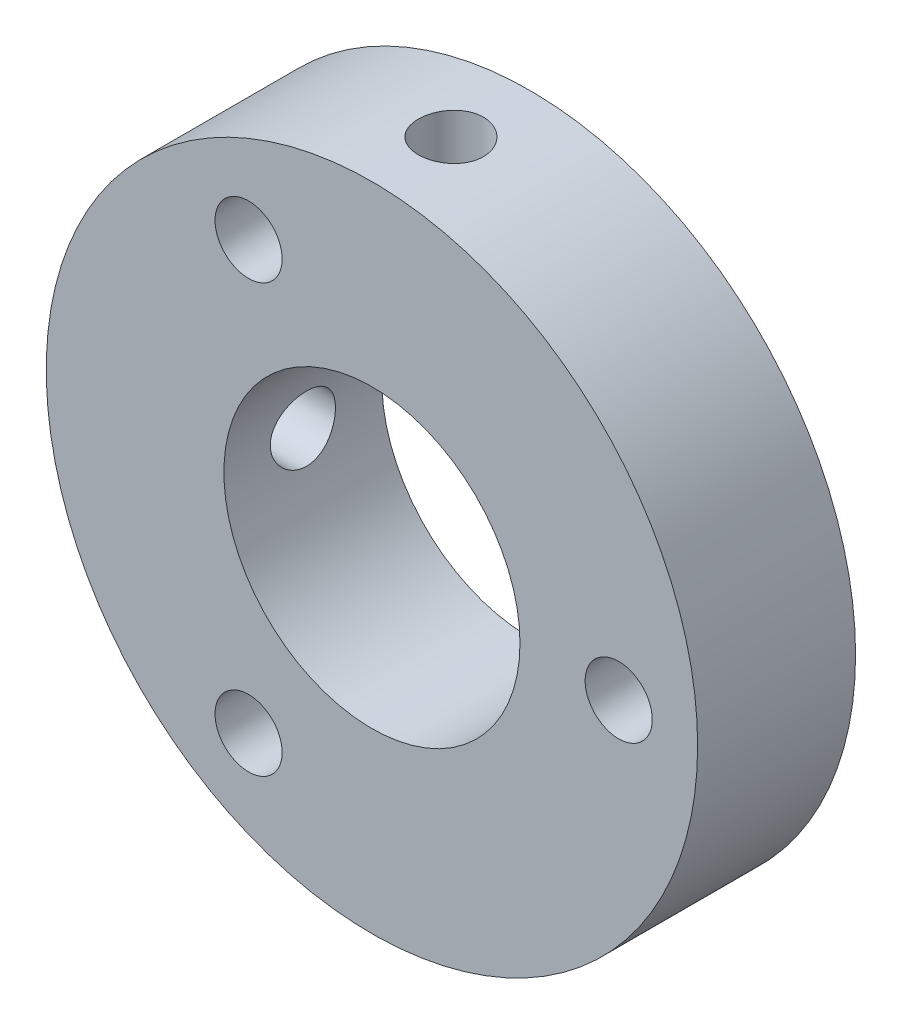
ISO-10303-21;
HEADER;
FILE_DESCRIPTION(('STEP AP214'),'2;1');
FILE_NAME('part.step','',(''),(''),'','','');
FILE_SCHEMA(('AUTOMOTIVE_DESIGN { 1 0 10303 214 1 1 1 1 }'));
ENDSEC;
DATA;
#1=APPLICATION_CONTEXT('core data for automotive mechanical design processes');
#2=APPLICATION_PROTOCOL_DEFINITION('international standard','automotive_design',2000,#1);
#3=PRODUCT_CONTEXT('',#1,'mechanical');
#4=PRODUCT('Part','Part','',(#3));
#5=PRODUCT_RELATED_PRODUCT_CATEGORY('part','',(#4));
#6=PRODUCT_DEFINITION_FORMATION('','',#4);
#7=PRODUCT_DEFINITION_CONTEXT('part definition',#1,'design');
#8=PRODUCT_DEFINITION('design','',#6,#7);
#9=PRODUCT_DEFINITION_SHAPE('','',#8);
#10=(LENGTH_UNIT() NAMED_UNIT(*) SI_UNIT(.MILLI.,.METRE.));
#11=(NAMED_UNIT(*) PLANE_ANGLE_UNIT() SI_UNIT($,.RADIAN.));
#12=(NAMED_UNIT(*) SI_UNIT($,.STERADIAN.) SOLID_ANGLE_UNIT());
#13=UNCERTAINTY_MEASURE_WITH_UNIT(LENGTH_MEASURE(1.E-05),#10,'distance_accuracy_value','');
#14=(GEOMETRIC_REPRESENTATION_CONTEXT(3) GLOBAL_UNCERTAINTY_ASSIGNED_CONTEXT((#13)) GLOBAL_UNIT_ASSIGNED_CONTEXT((#10,
#11,#12)) REPRESENTATION_CONTEXT('',''));
#15=CARTESIAN_POINT('',(0.,0.,0.));
#16=DIRECTION('',(0.,0.,1.));
#17=DIRECTION('',(1.,0.,0.));
#18=AXIS2_PLACEMENT_3D('',#15,#16,#17);
#19=CARTESIAN_POINT('',(0.,0.,8.));
#20=DIRECTION('',(0.,0.,1.));
#21=DIRECTION('',(1.,0.,0.));
#22=AXIS2_PLACEMENT_3D('',#19,#20,#21);
#23=PLANE('',#22);
#24=CARTESIAN_POINT('',(-6.25000000000005,10.8253175473055,8.));
#25=DIRECTION('',(0.,0.,1.));
#26=DIRECTION('',(1.,0.,0.));
#27=AXIS2_PLACEMENT_3D('',#24,#25,#26);
#28=CIRCLE('',#27,1.69999999999999);
#29=CARTESIAN_POINT('',(-4.55000000000007,10.8253175473055,8.));
#30=VERTEX_POINT('',#29);
#31=EDGE_CURVE('E68',#30,#30,#28,.T.);
#32=ORIENTED_EDGE('',*,*,#31,.F.);
#33=EDGE_LOOP('',(#32));
#34=FACE_BOUND('',#33,.T.);
#35=CARTESIAN_POINT('',(12.5,0.,8.));
#36=DIRECTION('',(0.,0.,1.));
#37=DIRECTION('',(1.,0.,0.));
#38=AXIS2_PLACEMENT_3D('',#35,#36,#37);
#39=CIRCLE('',#38,1.69999999999999);
#40=CARTESIAN_POINT('',(14.2,0.,8.));
#41=VERTEX_POINT('',#40);
#42=EDGE_CURVE('E62',#41,#41,#39,.T.);
#43=ORIENTED_EDGE('',*,*,#42,.F.);
#44=EDGE_LOOP('',(#43));
#45=FACE_BOUND('',#44,.T.);
#46=CARTESIAN_POINT('',(-6.25000000000005,-10.8253175473055,8.));
#47=DIRECTION('',(0.,0.,1.));
#48=DIRECTION('',(1.,0.,0.));
#49=AXIS2_PLACEMENT_3D('',#46,#47,#48);
#50=CIRCLE('',#49,1.69999999999999);
#51=CARTESIAN_POINT('',(-4.55000000000006,-10.8253175473055,8.));
#52=VERTEX_POINT('',#51);
#53=EDGE_CURVE('E56',#52,#52,#50,.T.);
#54=ORIENTED_EDGE('',*,*,#53,.F.);
#55=EDGE_LOOP('',(#54));
#56=FACE_BOUND('',#55,.T.);
#57=CARTESIAN_POINT('',(0.,0.,8.));
#58=DIRECTION('',(0.,0.,1.));
#59=DIRECTION('',(1.,0.,0.));
#60=AXIS2_PLACEMENT_3D('',#57,#58,#59);
#61=CIRCLE('',#60,16.5);
#62=CARTESIAN_POINT('',(16.5,0.,8.));
#63=VERTEX_POINT('',#62);
#64=EDGE_CURVE('E10',#63,#63,#61,.T.);
#65=ORIENTED_EDGE('',*,*,#64,.T.);
#66=EDGE_LOOP('',(#65));
#67=FACE_BOUND('',#66,.T.);
#68=CARTESIAN_POINT('',(0.,0.,8.));
#69=DIRECTION('',(0.,0.,1.));
#70=DIRECTION('',(1.,0.,0.));
#71=AXIS2_PLACEMENT_3D('',#68,#69,#70);
#72=CIRCLE('',#71,7.5);
#73=CARTESIAN_POINT('',(7.5,0.,8.));
#74=VERTEX_POINT('',#73);
#75=EDGE_CURVE('E46',#74,#74,#72,.T.);
#76=ORIENTED_EDGE('',*,*,#75,.F.);
#77=EDGE_LOOP('',(#76));
#78=FACE_BOUND('',#77,.T.);
#79=ADVANCED_FACE('F34',(#34,#45,#56,#67,#78),#23,.T.);
#80=CARTESIAN_POINT('',(0.,0.,0.));
#81=DIRECTION('',(0.,0.,1.));
#82=DIRECTION('',(1.,0.,0.));
#83=AXIS2_PLACEMENT_3D('',#80,#81,#82);
#84=PLANE('',#83);
#85=CARTESIAN_POINT('',(-6.25000000000005,10.8253175473055,0.));
#86=DIRECTION('',(0.,0.,1.));
#87=DIRECTION('',(1.,0.,0.));
#88=AXIS2_PLACEMENT_3D('',#85,#86,#87);
#89=CIRCLE('',#88,1.7);
#90=CARTESIAN_POINT('',(-4.55000000000006,10.8253175473055,0.));
#91=VERTEX_POINT('',#90);
#92=EDGE_CURVE('E65',#91,#91,#89,.T.);
#93=ORIENTED_EDGE('',*,*,#92,.T.);
#94=EDGE_LOOP('',(#93));
#95=FACE_BOUND('',#94,.T.);
#96=CARTESIAN_POINT('',(12.5,0.,0.));
#97=DIRECTION('',(0.,0.,1.));
#98=DIRECTION('',(1.,0.,0.));
#99=AXIS2_PLACEMENT_3D('',#96,#97,#98);
#100=CIRCLE('',#99,1.7);
#101=CARTESIAN_POINT('',(14.2,0.,0.));
#102=VERTEX_POINT('',#101);
#103=EDGE_CURVE('E59',#102,#102,#100,.T.);
#104=ORIENTED_EDGE('',*,*,#103,.T.);
#105=EDGE_LOOP('',(#104));
#106=FACE_BOUND('',#105,.T.);
#107=CARTESIAN_POINT('',(-6.25000000000005,-10.8253175473055,0.));
#108=DIRECTION('',(0.,0.,1.));
#109=DIRECTION('',(1.,0.,0.));
#110=AXIS2_PLACEMENT_3D('',#107,#108,#109);
#111=CIRCLE('',#110,1.7);
#112=CARTESIAN_POINT('',(-4.55000000000005,-10.8253175473055,0.));
#113=VERTEX_POINT('',#112);
#114=EDGE_CURVE('E51',#113,#113,#111,.T.);
#115=ORIENTED_EDGE('',*,*,#114,.T.);
#116=EDGE_LOOP('',(#115));
#117=FACE_BOUND('',#116,.T.);
#118=CARTESIAN_POINT('',(0.,0.,0.));
#119=DIRECTION('',(0.,0.,1.));
#120=DIRECTION('',(1.,0.,0.));
#121=AXIS2_PLACEMENT_3D('',#118,#119,#120);
#122=CIRCLE('',#121,16.5);
#123=CARTESIAN_POINT('',(16.5,0.,0.));
#124=VERTEX_POINT('',#123);
#125=EDGE_CURVE('E39',#124,#124,#122,.T.);
#126=ORIENTED_EDGE('',*,*,#125,.F.);
#127=EDGE_LOOP('',(#126));
#128=FACE_BOUND('',#127,.T.);
#129=CARTESIAN_POINT('',(0.,0.,0.));
#130=DIRECTION('',(0.,0.,1.));
#131=DIRECTION('',(1.,0.,0.));
#132=AXIS2_PLACEMENT_3D('',#129,#130,#131);
#133=CIRCLE('',#132,7.5);
#134=CARTESIAN_POINT('',(7.5,0.,0.));
#135=VERTEX_POINT('',#134);
#136=EDGE_CURVE('E48',#135,#135,#133,.T.);
#137=ORIENTED_EDGE('',*,*,#136,.T.);
#138=EDGE_LOOP('',(#137));
#139=FACE_BOUND('',#138,.T.);
#140=ADVANCED_FACE('F110',(#95,#106,#117,#128,#139),#84,.F.);
#141=CARTESIAN_POINT('',(0.,0.,8.));
#142=DIRECTION('',(0.,0.,-1.));
#143=DIRECTION('',(-1.,0.,0.));
#144=AXIS2_PLACEMENT_3D('',#141,#142,#143);
#145=CYLINDRICAL_SURFACE('',#144,16.5);
#146=CARTESIAN_POINT('',(0.,16.5,5.65));
#147=CARTESIAN_POINT('',(-0.092433583756069,16.4999989360927,5.64999599726437));
#148=CARTESIAN_POINT('',(-0.184928279526824,16.4992150223374,5.64220660632086));
#149=CARTESIAN_POINT('',(-0.367353357519778,16.4961632153132,5.61125078902078));
#150=CARTESIAN_POINT('',(-0.457280800628562,16.4938936871614,5.58806742155941));
#151=CARTESIAN_POINT('',(-0.631903264498127,16.4881268402907,5.52700530301355));
#152=CARTESIAN_POINT('',(-0.716601409614592,16.4846302632117,5.48913542714449));
#153=CARTESIAN_POINT('',(-0.878420665584658,16.4768002970061,5.39979250191275));
#154=CARTESIAN_POINT('',(-0.955543278985461,16.4724670743292,5.34832215759974));
#155=CARTESIAN_POINT('',(-1.10031825861222,16.4634317816319,5.23304054885721));
#156=CARTESIAN_POINT('',(-1.16793953897755,16.4587285759688,5.1691903309866));
#157=CARTESIAN_POINT('',(-1.2915251603611,16.4494927889533,5.03104451846595));
#158=CARTESIAN_POINT('',(-1.34748896218635,16.4449602155011,4.95674844093001));
#159=CARTESIAN_POINT('',(-1.44628105123193,16.4365672606209,4.79962542272197));
#160=CARTESIAN_POINT('',(-1.48908121800051,16.4327083257299,4.71678071724343));
#161=CARTESIAN_POINT('',(-1.56015153482551,16.4261136195177,4.54503528325673));
#162=CARTESIAN_POINT('',(-1.58842204387558,16.4233778204467,4.45613470443643));
#163=CARTESIAN_POINT('',(-1.62953841864307,16.4193493872041,4.27511802857103));
#164=CARTESIAN_POINT('',(-1.6424358274562,16.4180519315686,4.1830137481938));
#165=CARTESIAN_POINT('',(-1.65259922047328,16.4170321104987,3.99793937539691));
#166=CARTESIAN_POINT('',(-1.64986561553675,16.4173097036643,3.90496930579855));
#167=CARTESIAN_POINT('',(-1.62888706241684,16.4194042138324,3.72115773900597));
#168=CARTESIAN_POINT('',(-1.61069839280543,16.4212155457458,3.6303097461076));
#169=CARTESIAN_POINT('',(-1.55941358784838,16.4261647157424,3.45296236071815));
#170=CARTESIAN_POINT('',(-1.52631725112189,16.4293025717451,3.36646302698865));
#171=CARTESIAN_POINT('',(-1.44609447490439,16.4365576559592,3.20009058095679));
#172=CARTESIAN_POINT('',(-1.39894306648787,16.4406766244846,3.12022958734259));
#173=CARTESIAN_POINT('',(-1.29196654513273,16.4494283535925,2.96953339539536));
#174=CARTESIAN_POINT('',(-1.23214106125513,16.454061129211,2.89869846133006));
#175=CARTESIAN_POINT('',(-1.10120028547981,16.4633433576643,2.76773809991808));
#176=CARTESIAN_POINT('',(-1.03003639010464,16.4679927939945,2.70766125689664));
#177=CARTESIAN_POINT('',(-0.878607644866124,16.4767651797956,2.60029900569784));
#178=CARTESIAN_POINT('',(-0.798342784799229,16.4808881286762,2.5530136118618));
#179=CARTESIAN_POINT('',(-0.630956874392287,16.4881443485071,2.47257846648807));
#180=CARTESIAN_POINT('',(-0.543834631543225,16.4912774468437,2.43943118005019));
#181=CARTESIAN_POINT('',(-0.365222908594271,16.4961991827832,2.38824878742561));
#182=CARTESIAN_POINT('',(-0.273733559181274,16.4979878605915,2.37021322931547));
#183=CARTESIAN_POINT('',(-0.0894054135015252,16.5000140525271,2.34982789223764));
#184=CARTESIAN_POINT('',(0.0034258984741773,16.5002581964176,2.34741107038339));
#185=CARTESIAN_POINT('',(0.188172258971019,16.4991855889871,2.35815572403048));
#186=CARTESIAN_POINT('',(0.280087319853889,16.4978688587537,2.37131698907023));
#187=CARTESIAN_POINT('',(0.460198541277324,16.4938267153967,2.41278859744563));
#188=CARTESIAN_POINT('',(0.548402000803941,16.4911042216476,2.44106754988875));
#189=CARTESIAN_POINT('',(0.718813130283346,16.4845559812,2.51193953716153));
#190=CARTESIAN_POINT('',(0.801020665759348,16.4807302097667,2.55453289291504));
#191=CARTESIAN_POINT('',(0.957409497284135,16.472386842952,2.6529908837955));
#192=CARTESIAN_POINT('',(1.03156293858581,16.4678669694568,2.70889956672764));
#193=CARTESIAN_POINT('',(1.16945667846469,16.4586498923471,2.83233801177258));
#194=CARTESIAN_POINT('',(1.23319671560123,16.453952684284,2.89986806556607));
#195=CARTESIAN_POINT('',(1.34868708131388,16.4448903983224,3.04492484818741));
#196=CARTESIAN_POINT('',(1.40039340982133,16.4405265772931,3.12248669829538));
#197=CARTESIAN_POINT('',(1.49004612692739,16.4326442356047,3.28523214424209));
#198=CARTESIAN_POINT('',(1.52799270368898,16.4291257033866,3.37041563583591));
#199=CARTESIAN_POINT('',(1.58897509432945,16.4233401359618,3.54583542011862));
#200=CARTESIAN_POINT('',(1.61203708843963,16.4210709044215,3.63606253615041));
#201=CARTESIAN_POINT('',(1.64268061176367,16.4180340271675,3.81913227663534));
#202=CARTESIAN_POINT('',(1.65026258495926,16.4172663383881,3.91197482599792));
#203=CARTESIAN_POINT('',(1.64972467847762,16.4173203662748,4.09720263578863));
#204=CARTESIAN_POINT('',(1.64167391782868,16.4181350864356,4.18958810675671));
#205=CARTESIAN_POINT('',(1.61024399739006,16.4212472141775,4.37168711332774));
#206=CARTESIAN_POINT('',(1.5868648203576,16.4235446234263,4.46140064592492));
#207=CARTESIAN_POINT('',(1.52546078239091,16.4293613263426,4.63560862592902));
#208=CARTESIAN_POINT('',(1.48743794816254,16.432880450916,4.7201037936891));
#209=CARTESIAN_POINT('',(1.39783306560324,16.4407444053494,4.88152387125726));
#210=CARTESIAN_POINT('',(1.34625109320145,16.4450892305857,4.95844882345409));
#211=CARTESIAN_POINT('',(1.23073261787081,16.45413803896,5.10289906287873));
#212=CARTESIAN_POINT('',(1.16674461566895,16.4588434679914,5.17038307600573));
#213=CARTESIAN_POINT('',(1.02833230372144,16.4680701030249,5.29368618395447));
#214=CARTESIAN_POINT('',(0.95390549777863,16.4725912646291,5.34950248073936));
#215=CARTESIAN_POINT('',(0.796523366366131,16.4809517741412,5.44799619886015));
#216=CARTESIAN_POINT('',(0.713547036422163,16.4847893764424,5.49064018005957));
#217=CARTESIAN_POINT('',(0.54162616051591,16.4913313826233,5.5613329976594));
#218=CARTESIAN_POINT('',(0.452688472212255,16.4940370635093,5.58939829007337));
#219=CARTESIAN_POINT('',(0.302706131319412,16.4973305272666,5.62313901818993));
#220=CARTESIAN_POINT('',(0.242620212193439,16.4983269114152,5.63319812309394));
#221=CARTESIAN_POINT('',(0.121698358348566,16.499661996688,5.64662991800191));
#222=CARTESIAN_POINT('',(0.0608624267238203,16.5000007005244,5.65000263558107));
#223=CARTESIAN_POINT('',(0.,16.5,5.65));
#224=B_SPLINE_CURVE_WITH_KNOTS('',3,(#146,#147,#148,#149,#150,#151,#152,#153,#154,#155,#156,
#157,#158,#159,#160,#161,#162,#163,#164,#165,#166,#167,#168,#169,#170,#171,#172,#173,#174,#175,
#176,#177,#178,#179,#180,#181,#182,#183,#184,#185,#186,#187,#188,#189,#190,#191,#192,#193,#194,
#195,#196,#197,#198,#199,#200,#201,#202,#203,#204,#205,#206,#207,#208,#209,#210,#211,#212,#213,
#214,#215,#216,#217,#218,#219,#220,#221,#222,#223),.UNSPECIFIED.,.T.,.F.,(4,2,2,2,2,2,2,2,2,2,2,
2,2,2,2,2,2,2,2,2,2,2,2,2,2,2,2,2,2,2,2,2,2,2,2,2,2,2,4),(0.,0.27707850434298,0.55446244067855,
0.83167901145813,1.10884048701159,1.38688863822785,1.66494964714164,1.94360059529165,
2.2222446583013,2.49995182874573,2.7776516997203,3.05434465777831,3.33104135366694,
3.60823256265274,3.88543188546355,4.16385311423739,4.44227465516621,4.72074472144407,
4.99920645964473,5.27647211202798,5.55373401856584,5.830422432356,6.10711704981617,
6.38474002235349,6.66236996386876,6.94099961954184,7.21962546484364,7.49775989478451,
7.77588634745312,8.05278588335024,8.32968573072962,8.60654726848616,8.8834072558928,
9.16144213755624,9.43954361850976,9.71834541193295,9.99683181412232,10.1792735093337,
10.3617144521389),.UNSPECIFIED.);
#225=CARTESIAN_POINT('',(0.,16.5,5.65));
#226=VERTEX_POINT('',#225);
#227=EDGE_CURVE('E145',#226,#226,#224,.T.);
#228=ORIENTED_EDGE('',*,*,#227,.T.);
#229=EDGE_LOOP('',(#228));
#230=FACE_BOUND('',#229,.T.);
#231=CARTESIAN_POINT('',(-16.5,0.,5.65));
#232=CARTESIAN_POINT('',(-16.4999989360927,-0.0924335837560692,5.64999599726437));
#233=CARTESIAN_POINT('',(-16.4992150223374,-0.184928279526825,5.64220660632086));
#234=CARTESIAN_POINT('',(-16.4961632153132,-0.36735335751978,5.61125078902079));
#235=CARTESIAN_POINT('',(-16.4938936871614,-0.457280800628565,5.58806742155943));
#236=CARTESIAN_POINT('',(-16.4881268402907,-0.631903264498133,5.52700530301357));
#237=CARTESIAN_POINT('',(-16.4846302632117,-0.7166014096146,5.48913542714452));
#238=CARTESIAN_POINT('',(-16.4768002970061,-0.878420665584669,5.39979250191278));
#239=CARTESIAN_POINT('',(-16.4724670743292,-0.955543278985475,5.34832215759977));
#240=CARTESIAN_POINT('',(-16.4634317816318,-1.10031825861223,5.23304054885724));
#241=CARTESIAN_POINT('',(-16.4587285759688,-1.16793953897757,5.16919033098664));
#242=CARTESIAN_POINT('',(-16.4494927889533,-1.29152516036112,5.031044518466));
#243=CARTESIAN_POINT('',(-16.4449602155011,-1.34748896218638,4.95674844093006));
#244=CARTESIAN_POINT('',(-16.4365672606209,-1.44628105123197,4.79962542272202));
#245=CARTESIAN_POINT('',(-16.4327083257299,-1.48908121800055,4.71678071724348));
#246=CARTESIAN_POINT('',(-16.4261136195177,-1.56015153482555,4.54503528325678));
#247=CARTESIAN_POINT('',(-16.4233778204467,-1.58842204387563,4.45613470443648));
#248=CARTESIAN_POINT('',(-16.4193493872041,-1.62953841864312,4.27511802857108));
#249=CARTESIAN_POINT('',(-16.4180519315686,-1.64243582745626,4.18301374819386));
#250=CARTESIAN_POINT('',(-16.4170321104987,-1.65259922047334,3.99793937539696));
#251=CARTESIAN_POINT('',(-16.4173097036643,-1.64986561553682,3.9049693057986));
#252=CARTESIAN_POINT('',(-16.4194042138324,-1.62888706241692,3.72115773900602));
#253=CARTESIAN_POINT('',(-16.4212155457457,-1.61069839280551,3.63030974610765));
#254=CARTESIAN_POINT('',(-16.4261647157424,-1.55941358784847,3.4529623607182));
#255=CARTESIAN_POINT('',(-16.4293025717451,-1.52631725112198,3.3664630269887));
#256=CARTESIAN_POINT('',(-16.4365576559592,-1.44609447490449,3.20009058095683));
#257=CARTESIAN_POINT('',(-16.4406766244846,-1.39894306648796,3.12022958734263));
#258=CARTESIAN_POINT('',(-16.4494283535925,-1.29196654513282,2.9695333953954));
#259=CARTESIAN_POINT('',(-16.4540611292109,-1.23214106125523,2.89869846133009));
#260=CARTESIAN_POINT('',(-16.4633433576643,-1.10120028547991,2.76773809991811));
#261=CARTESIAN_POINT('',(-16.4679927939945,-1.03003639010475,2.70766125689667));
#262=CARTESIAN_POINT('',(-16.4767651797955,-0.878607644866234,2.60029900569786));
#263=CARTESIAN_POINT('',(-16.4808881286762,-0.79834278479934,2.55301361186182));
#264=CARTESIAN_POINT('',(-16.4881443485071,-0.630956874392401,2.47257846648808));
#265=CARTESIAN_POINT('',(-16.4912774468437,-0.54383463154334,2.4394311800502));
#266=CARTESIAN_POINT('',(-16.4961991827832,-0.365222908594388,2.38824878742561));
#267=CARTESIAN_POINT('',(-16.4979878605915,-0.273733559181391,2.37021322931547));
#268=CARTESIAN_POINT('',(-16.5000140525271,-0.0894054135016416,2.34982789223764));
#269=CARTESIAN_POINT('',(-16.5002581964176,0.00342589847406116,2.34741107038338));
#270=CARTESIAN_POINT('',(-16.4991855889871,0.188172258970904,2.35815572403046));
#271=CARTESIAN_POINT('',(-16.4978688587537,0.280087319853774,2.37131698907021));
#272=CARTESIAN_POINT('',(-16.4938267153967,0.460198541277212,2.4127885974456));
#273=CARTESIAN_POINT('',(-16.4911042216476,0.54840200080383,2.44106754988872));
#274=CARTESIAN_POINT('',(-16.4845559812001,0.718813130283238,2.5119395371615));
#275=CARTESIAN_POINT('',(-16.4807302097667,0.801020665759242,2.55453289291501));
#276=CARTESIAN_POINT('',(-16.472386842952,0.957409497284033,2.65299088379546));
#277=CARTESIAN_POINT('',(-16.4678669694568,1.03156293858571,2.7088995667276));
#278=CARTESIAN_POINT('',(-16.4586498923471,1.1694566784646,2.83233801177253));
#279=CARTESIAN_POINT('',(-16.453952684284,1.23319671560114,2.89986806556602));
#280=CARTESIAN_POINT('',(-16.4448903983225,1.34868708131379,3.04492484818735));
#281=CARTESIAN_POINT('',(-16.4405265772931,1.40039340982124,3.12248669829533));
#282=CARTESIAN_POINT('',(-16.4326442356047,1.49004612692731,3.28523214424203));
#283=CARTESIAN_POINT('',(-16.4291257033866,1.5279927036889,3.37041563583585));
#284=CARTESIAN_POINT('',(-16.4233401359618,1.58897509432938,3.54583542011856));
#285=CARTESIAN_POINT('',(-16.4210709044215,1.61203708843957,3.63606253615035));
#286=CARTESIAN_POINT('',(-16.4180340271675,1.64268061176361,3.81913227663527));
#287=CARTESIAN_POINT('',(-16.4172663383881,1.6502625849592,3.91197482599786));
#288=CARTESIAN_POINT('',(-16.4173203662748,1.64972467847757,4.09720263578856));
#289=CARTESIAN_POINT('',(-16.4181350864357,1.64167391782863,4.18958810675664));
#290=CARTESIAN_POINT('',(-16.4212472141775,1.61024399739002,4.37168711332767));
#291=CARTESIAN_POINT('',(-16.4235446234264,1.58686482035756,4.46140064592486));
#292=CARTESIAN_POINT('',(-16.4293613263426,1.52546078239088,4.63560862592896));
#293=CARTESIAN_POINT('',(-16.432880450916,1.48743794816251,4.72010379368904));
#294=CARTESIAN_POINT('',(-16.4407444053494,1.39783306560322,4.8815238712572));
#295=CARTESIAN_POINT('',(-16.4450892305857,1.34625109320143,4.95844882345404));
#296=CARTESIAN_POINT('',(-16.45413803896,1.2307326178708,5.10289906287869));
#297=CARTESIAN_POINT('',(-16.4588434679914,1.16674461566894,5.17038307600569));
#298=CARTESIAN_POINT('',(-16.4680701030249,1.02833230372143,5.29368618395443));
#299=CARTESIAN_POINT('',(-16.4725912646291,0.953905497778623,5.34950248073933));
#300=CARTESIAN_POINT('',(-16.4809517741412,0.796523366366127,5.44799619886012));
#301=CARTESIAN_POINT('',(-16.4847893764424,0.71354703642216,5.49064018005955));
#302=CARTESIAN_POINT('',(-16.4913313826233,0.541626160515909,5.56133299765938));
#303=CARTESIAN_POINT('',(-16.4940370635093,0.452688472212256,5.58939829007335));
#304=CARTESIAN_POINT('',(-16.4973305272666,0.302706131319412,5.62313901818992));
#305=CARTESIAN_POINT('',(-16.4983269114152,0.24262021219344,5.63319812309394));
#306=CARTESIAN_POINT('',(-16.499661996688,0.121698358348567,5.6466299180019));
#307=CARTESIAN_POINT('',(-16.5000007005244,0.0608624267238205,5.65000263558107));
#308=CARTESIAN_POINT('',(-16.5,0.,5.65));
#309=B_SPLINE_CURVE_WITH_KNOTS('',3,(#231,#232,#233,#234,#235,#236,#237,#238,#239,#240,#241,
#242,#243,#244,#245,#246,#247,#248,#249,#250,#251,#252,#253,#254,#255,#256,#257,#258,#259,#260,
#261,#262,#263,#264,#265,#266,#267,#268,#269,#270,#271,#272,#273,#274,#275,#276,#277,#278,#279,
#280,#281,#282,#283,#284,#285,#286,#287,#288,#289,#290,#291,#292,#293,#294,#295,#296,#297,#298,
#299,#300,#301,#302,#303,#304,#305,#306,#307,#308),.UNSPECIFIED.,.T.,.F.,(4,2,2,2,2,2,2,2,2,2,2,
2,2,2,2,2,2,2,2,2,2,2,2,2,2,2,2,2,2,2,2,2,2,2,2,2,2,2,4),(0.,0.277078504342981,
0.554462440678552,0.831679011458132,1.10884048701159,1.38688863822786,1.66494964714164,
1.94360059529166,2.22224465830131,2.49995182874574,2.77765169972031,3.05434465777832,
3.33104135366695,3.60823256265275,3.88543188546356,4.1638531142374,4.44227465516623,
4.72074472144409,4.99920645964474,5.27647211202799,5.55373401856586,5.83042243235602,
6.10711704981619,6.38474002235351,6.66236996386878,6.94099961954186,7.21962546484366,
7.49775989478454,7.77588634745314,8.05278588335027,8.32968573072964,8.60654726848619,
8.88340725589283,9.16144213755627,9.43954361850979,9.71834541193298,9.99683181412235,
10.1792735093337,10.3617144521389),.UNSPECIFIED.);
#310=CARTESIAN_POINT('',(-16.5,0.,5.65));
#311=VERTEX_POINT('',#310);
#312=EDGE_CURVE('E71',#311,#311,#309,.T.);
#313=ORIENTED_EDGE('',*,*,#312,.T.);
#314=EDGE_LOOP('',(#313));
#315=FACE_BOUND('',#314,.T.);
#316=ORIENTED_EDGE('',*,*,#64,.F.);
#317=EDGE_LOOP('',(#316));
#318=FACE_BOUND('',#317,.T.);
#319=ORIENTED_EDGE('',*,*,#125,.T.);
#320=EDGE_LOOP('',(#319));
#321=FACE_BOUND('',#320,.T.);
#322=ADVANCED_FACE('F36',(#230,#315,#318,#321),#145,.T.);
#323=CARTESIAN_POINT('',(0.,0.,8.));
#324=DIRECTION('',(0.,0.,-1.));
#325=DIRECTION('',(-1.,0.,0.));
#326=AXIS2_PLACEMENT_3D('',#323,#324,#325);
#327=CYLINDRICAL_SURFACE('',#326,7.5);
#328=CARTESIAN_POINT('',(0.,7.5,5.65));
#329=CARTESIAN_POINT('',(-0.0914999393407434,7.49999831424106,5.64999689388329));
#330=CARTESIAN_POINT('',(-0.183037296855674,7.49830854961464,5.64236318106866));
#331=CARTESIAN_POINT('',(-0.363511023320091,7.49173097533343,5.61206225940868));
#332=CARTESIAN_POINT('',(-0.452445501714979,7.4868408985997,5.58938439323356));
#333=CARTESIAN_POINT('',(-0.625079242768144,7.47440705823354,5.52974055396921));
#334=CARTESIAN_POINT('',(-0.708783898837665,7.46686608345358,5.4927895927343));
#335=CARTESIAN_POINT('',(-0.868802700314421,7.44994391473521,5.40569630891618));
#336=CARTESIAN_POINT('',(-0.945117019602259,7.44056276410837,5.35555429679659));
#337=CARTESIAN_POINT('',(-1.08942970934255,7.42081741826454,5.24264148918915));
#338=CARTESIAN_POINT('',(-1.15729102940926,7.41044091267738,5.17969766887049));
#339=CARTESIAN_POINT('',(-1.28158292851935,7.38996090019823,5.04333940178755));
#340=CARTESIAN_POINT('',(-1.33801247885249,7.37985741794561,4.96992401373074));
#341=CARTESIAN_POINT('',(-1.43844520787666,7.36094592663127,4.81369134292981));
#342=CARTESIAN_POINT('',(-1.48230220287266,7.35215368644804,4.7307780079661));
#343=CARTESIAN_POINT('',(-1.55540709540182,7.33703697303095,4.55853274582511));
#344=CARTESIAN_POINT('',(-1.58465676165367,7.33071220104564,4.46920159724356));
#345=CARTESIAN_POINT('',(-1.62726320761453,7.32137195378111,4.28814395939664));
#346=CARTESIAN_POINT('',(-1.64086278535646,7.3183059798586,4.19647726630275));
#347=CARTESIAN_POINT('',(-1.65253801366895,7.31567882302513,4.01211606415167));
#348=CARTESIAN_POINT('',(-1.65061559546275,7.31611720410755,3.91942168439078));
#349=CARTESIAN_POINT('',(-1.63149672802124,7.32040352024316,3.73744348167058));
#350=CARTESIAN_POINT('',(-1.61458260643195,7.32418842940724,3.64812828725854));
#351=CARTESIAN_POINT('',(-1.56640787267824,7.33464165989448,3.47363508632755));
#352=CARTESIAN_POINT('',(-1.5351464471931,7.34131014468068,3.38845731465378));
#353=CARTESIAN_POINT('',(-1.45890598688928,7.35684109933613,3.22386456484735));
#354=CARTESIAN_POINT('',(-1.41381862824292,7.36572078647477,3.14450145530904));
#355=CARTESIAN_POINT('',(-1.31128231696184,7.38466310141161,2.99436318177397));
#356=CARTESIAN_POINT('',(-1.25383166066748,7.39472589215444,2.92358920346178));
#357=CARTESIAN_POINT('',(-1.12670629880243,7.41517081765932,2.79101303710661));
#358=CARTESIAN_POINT('',(-1.05679158832987,7.42555512168708,2.72944109133507));
#359=CARTESIAN_POINT('',(-0.907510905058897,7.445272552529,2.61885837608795));
#360=CARTESIAN_POINT('',(-0.828144757197981,7.45460565986634,2.56984783933176));
#361=CARTESIAN_POINT('',(-0.661931267895231,7.4711999610659,2.48572123553566));
#362=CARTESIAN_POINT('',(-0.575068033653527,7.47845660535504,2.45063561420552));
#363=CARTESIAN_POINT('',(-0.39648364085879,7.49004657125319,2.39562258522819));
#364=CARTESIAN_POINT('',(-0.304763199289777,7.49438032302729,2.37569294700434));
#365=CARTESIAN_POINT('',(-0.121042700683189,7.49957488574714,2.3518931377467));
#366=CARTESIAN_POINT('',(-0.0290852501339144,7.50050369388944,2.34770849163739));
#367=CARTESIAN_POINT('',(0.154214783533936,7.49897438369855,2.35466469502872));
#368=CARTESIAN_POINT('',(0.24555740843643,7.49651649791088,2.3658044922846));
#369=CARTESIAN_POINT('',(0.423991007748988,7.48853291011624,2.40283265132216));
#370=CARTESIAN_POINT('',(0.511117938303482,7.48304158779087,2.42855581582792));
#371=CARTESIAN_POINT('',(0.679820246095689,7.46960587824171,2.49383695756339));
#372=CARTESIAN_POINT('',(0.761395145868597,7.46166128036508,2.53339612287331));
#373=CARTESIAN_POINT('',(0.917976261781507,7.44403270371492,2.62587978321852));
#374=CARTESIAN_POINT('',(0.992870859505204,7.43432530594192,2.67898869227591));
#375=CARTESIAN_POINT('',(1.13279771208187,7.41429527403408,2.79682171018652));
#376=CARTESIAN_POINT('',(1.19782866797863,7.40397255911622,2.86154734641593));
#377=CARTESIAN_POINT('',(1.31742759988636,7.38364007713335,3.00222027859978));
#378=CARTESIAN_POINT('',(1.37177769648963,7.37363974382099,3.0783544312955));
#379=CARTESIAN_POINT('',(1.46692164784544,7.35530407569122,3.23885442521819));
#380=CARTESIAN_POINT('',(1.50771609134856,7.34696866856883,3.32321990873517));
#381=CARTESIAN_POINT('',(1.57431369753852,7.33298679212085,3.4973341693029));
#382=CARTESIAN_POINT('',(1.60020149826096,7.32732517503715,3.58704929627586));
#383=CARTESIAN_POINT('',(1.63649815552647,7.3193049964368,3.76969698070692));
#384=CARTESIAN_POINT('',(1.64690952060544,7.31694589962668,3.86262901424551));
#385=CARTESIAN_POINT('',(1.65185003885165,7.31583187657224,4.0468749692852));
#386=CARTESIAN_POINT('',(1.64672474541732,7.31699853171659,4.13817931994234));
#387=CARTESIAN_POINT('',(1.62151064971417,7.32262705863687,4.31858911375489));
#388=CARTESIAN_POINT('',(1.60142202805468,7.32708889063958,4.40769458343767));
#389=CARTESIAN_POINT('',(1.54701934318011,7.33876659051327,4.58089887364455));
#390=CARTESIAN_POINT('',(1.51275612845815,7.34597260690616,4.66501437374035));
#391=CARTESIAN_POINT('',(1.43102033898965,7.36233049430585,4.82635416226081));
#392=CARTESIAN_POINT('',(1.38354636957816,7.37148257073496,4.90357772196298));
#393=CARTESIAN_POINT('',(1.27559296460688,7.39093521541418,5.05064370885943));
#394=CARTESIAN_POINT('',(1.21486750796972,7.40125543681465,5.12030297965252));
#395=CARTESIAN_POINT('',(1.08263275210784,7.42175007997792,5.2485559345428));
#396=CARTESIAN_POINT('',(1.01112096165044,7.43192446746263,5.30714705525868));
#397=CARTESIAN_POINT('',(0.858209468644046,7.45113988726204,5.41233915166255));
#398=CARTESIAN_POINT('',(0.776692042971363,7.46016424553825,5.45877221861649));
#399=CARTESIAN_POINT('',(0.606827789468337,7.47589523887678,5.53720389832133));
#400=CARTESIAN_POINT('',(0.518486730197588,7.48260380597825,5.56921455037323));
#401=CARTESIAN_POINT('',(0.358388456603711,7.49175811514749,5.61222376891093));
#402=CARTESIAN_POINT('',(0.287493809384384,7.4948296001288,5.62636269380082));
#403=CARTESIAN_POINT('',(0.144407171386714,7.49895116200565,5.64525182243697));
#404=CARTESIAN_POINT('',(0.0722152395238499,7.5000013304652,5.65000245146569));
#405=CARTESIAN_POINT('',(0.,7.5,5.65));
#406=B_SPLINE_CURVE_WITH_KNOTS('',3,(#328,#329,#330,#331,#332,#333,#334,#335,#336,#337,#338,
#339,#340,#341,#342,#343,#344,#345,#346,#347,#348,#349,#350,#351,#352,#353,#354,#355,#356,#357,
#358,#359,#360,#361,#362,#363,#364,#365,#366,#367,#368,#369,#370,#371,#372,#373,#374,#375,#376,
#377,#378,#379,#380,#381,#382,#383,#384,#385,#386,#387,#388,#389,#390,#391,#392,#393,#394,#395,
#396,#397,#398,#399,#400,#401,#402,#403,#404,#405),.UNSPECIFIED.,.T.,.F.,(4,2,2,2,2,2,2,2,2,2,2,
2,2,2,2,2,2,2,2,2,2,2,2,2,2,2,2,2,2,2,2,2,2,2,2,2,2,2,4),(0.,0.274235469748508,
0.548665416592521,0.822807511778601,1.09694315535337,1.37506480293447,1.65321146673233,
1.93447194708654,2.21569836294015,2.49250033112996,2.76926786056845,3.04093142111882,
3.31261038365022,3.58647477653389,3.86037693206285,4.14027337309167,4.42017499925701,
4.70068528026744,4.98115426927861,5.25599076583744,5.53080839183634,5.8025734223078,
6.07436179463611,6.35006739343502,6.62580926880842,6.90669641720307,7.18757136448179,
7.46683540152296,7.74605416843227,8.01910869065846,8.29215991713438,8.56424000622431,
8.83634882982829,9.11402013989233,9.39175567994314,9.67314563039328,9.95430024968244,
10.1707471396203,10.3871842244587),.UNSPECIFIED.);
#407=CARTESIAN_POINT('',(0.,7.5,5.65));
#408=VERTEX_POINT('',#407);
#409=EDGE_CURVE('E150',#408,#408,#406,.T.);
#410=ORIENTED_EDGE('',*,*,#409,.F.);
#411=EDGE_LOOP('',(#410));
#412=FACE_BOUND('',#411,.T.);
#413=CARTESIAN_POINT('',(-7.5,0.,5.65));
#414=CARTESIAN_POINT('',(-7.49999831424106,-0.0914999393408014,5.64999689388329));
#415=CARTESIAN_POINT('',(-7.49830854961464,-0.183037296855733,5.64236318106866));
#416=CARTESIAN_POINT('',(-7.49173097533343,-0.36351102332015,5.61206225940868));
#417=CARTESIAN_POINT('',(-7.48684089859969,-0.452445501715038,5.58938439323356));
#418=CARTESIAN_POINT('',(-7.47440705823353,-0.625079242768204,5.52974055396921));
#419=CARTESIAN_POINT('',(-7.46686608345357,-0.708783898837726,5.4927895927343));
#420=CARTESIAN_POINT('',(-7.4499439147352,-0.868802700314482,5.40569630891618));
#421=CARTESIAN_POINT('',(-7.44056276410836,-0.94511701960232,5.35555429679659));
#422=CARTESIAN_POINT('',(-7.42081741826453,-1.08942970934262,5.24264148918915));
#423=CARTESIAN_POINT('',(-7.41044091267737,-1.15729102940932,5.17969766887049));
#424=CARTESIAN_POINT('',(-7.38996090019822,-1.28158292851941,5.04333940178755));
#425=CARTESIAN_POINT('',(-7.3798574179456,-1.33801247885255,4.96992401373074));
#426=CARTESIAN_POINT('',(-7.36094592663126,-1.43844520787672,4.81369134292981));
#427=CARTESIAN_POINT('',(-7.35215368644803,-1.48230220287273,4.7307780079661));
#428=CARTESIAN_POINT('',(-7.33703697303094,-1.55540709540189,4.5585327458251));
#429=CARTESIAN_POINT('',(-7.33071220104563,-1.58465676165373,4.46920159724356));
#430=CARTESIAN_POINT('',(-7.3213719537811,-1.62726320761459,4.28814395939664));
#431=CARTESIAN_POINT('',(-7.31830597985859,-1.64086278535653,4.19647726630274));
#432=CARTESIAN_POINT('',(-7.31567882302511,-1.65253801366901,4.01211606415167));
#433=CARTESIAN_POINT('',(-7.31611720410754,-1.65061559546281,3.91942168439077));
#434=CARTESIAN_POINT('',(-7.32040352024315,-1.6314967280213,3.73744348167057));
#435=CARTESIAN_POINT('',(-7.32418842940723,-1.61458260643201,3.64812828725854));
#436=CARTESIAN_POINT('',(-7.33464165989446,-1.56640787267831,3.47363508632754));
#437=CARTESIAN_POINT('',(-7.34131014468067,-1.53514644719316,3.38845731465377));
#438=CARTESIAN_POINT('',(-7.35684109933612,-1.45890598688935,3.22386456484734));
#439=CARTESIAN_POINT('',(-7.36572078647476,-1.41381862824298,3.14450145530904));
#440=CARTESIAN_POINT('',(-7.38466310141159,-1.3112823169619,2.99436318177396));
#441=CARTESIAN_POINT('',(-7.39472589215443,-1.25383166066754,2.92358920346177));
#442=CARTESIAN_POINT('',(-7.41517081765931,-1.12670629880249,2.7910130371066));
#443=CARTESIAN_POINT('',(-7.42555512168707,-1.05679158832994,2.72944109133507));
#444=CARTESIAN_POINT('',(-7.44527255252899,-0.907510905058959,2.61885837608795));
#445=CARTESIAN_POINT('',(-7.45460565986633,-0.828144757198043,2.56984783933175));
#446=CARTESIAN_POINT('',(-7.4711999610659,-0.661931267895292,2.48572123553565));
#447=CARTESIAN_POINT('',(-7.47845660535503,-0.575068033653588,2.45063561420551));
#448=CARTESIAN_POINT('',(-7.49004657125319,-0.39648364085885,2.39562258522818));
#449=CARTESIAN_POINT('',(-7.49438032302729,-0.304763199289837,2.37569294700433));
#450=CARTESIAN_POINT('',(-7.49957488574714,-0.121042700683248,2.35189313774669));
#451=CARTESIAN_POINT('',(-7.50050369388944,-0.0290852501339725,2.34770849163738));
#452=CARTESIAN_POINT('',(-7.49897438369855,0.154214783533878,2.35466469502871));
#453=CARTESIAN_POINT('',(-7.49651649791089,0.245557408436373,2.36580449228459));
#454=CARTESIAN_POINT('',(-7.48853291011624,0.423991007748932,2.40283265132215));
#455=CARTESIAN_POINT('',(-7.48304158779087,0.511117938303426,2.42855581582791));
#456=CARTESIAN_POINT('',(-7.46960587824172,0.679820246095634,2.49383695756339));
#457=CARTESIAN_POINT('',(-7.46166128036508,0.761395145868542,2.5333961228733));
#458=CARTESIAN_POINT('',(-7.44403270371493,0.917976261781452,2.62587978321851));
#459=CARTESIAN_POINT('',(-7.43432530594193,0.99287085950515,2.6789886922759));
#460=CARTESIAN_POINT('',(-7.41429527403409,1.13279771208182,2.79682171018652));
#461=CARTESIAN_POINT('',(-7.40397255911623,1.19782866797858,2.86154734641592));
#462=CARTESIAN_POINT('',(-7.38364007713336,1.3174275998863,3.00222027859977));
#463=CARTESIAN_POINT('',(-7.373639743821,1.37177769648958,3.07835443129549));
#464=CARTESIAN_POINT('',(-7.35530407569123,1.46692164784539,3.23885442521818));
#465=CARTESIAN_POINT('',(-7.34696866856884,1.50771609134851,3.32321990873516));
#466=CARTESIAN_POINT('',(-7.33298679212086,1.57431369753847,3.49733416930289));
#467=CARTESIAN_POINT('',(-7.32732517503717,1.60020149826091,3.58704929627586));
#468=CARTESIAN_POINT('',(-7.31930499643681,1.63649815552641,3.76969698070692));
#469=CARTESIAN_POINT('',(-7.3169458996267,1.64690952060538,3.8626290142455));
#470=CARTESIAN_POINT('',(-7.31583187657225,1.6518500388516,4.04687496928519));
#471=CARTESIAN_POINT('',(-7.3169985317166,1.64672474541726,4.13817931994233));
#472=CARTESIAN_POINT('',(-7.32262705863688,1.62151064971412,4.31858911375489));
#473=CARTESIAN_POINT('',(-7.32708889063959,1.60142202805462,4.40769458343767));
#474=CARTESIAN_POINT('',(-7.33876659051329,1.54701934318006,4.58089887364454));
#475=CARTESIAN_POINT('',(-7.34597260690617,1.5127561284581,4.66501437374035));
#476=CARTESIAN_POINT('',(-7.36233049430586,1.4310203389896,4.82635416226081));
#477=CARTESIAN_POINT('',(-7.37148257073497,1.38354636957811,4.90357772196298));
#478=CARTESIAN_POINT('',(-7.3909352154142,1.27559296460683,5.05064370885943));
#479=CARTESIAN_POINT('',(-7.40125543681466,1.21486750796967,5.12030297965252));
#480=CARTESIAN_POINT('',(-7.42175007997792,1.08263275210779,5.2485559345428));
#481=CARTESIAN_POINT('',(-7.43192446746263,1.01112096165039,5.30714705525868));
#482=CARTESIAN_POINT('',(-7.45113988726204,0.858209468643989,5.41233915166255));
#483=CARTESIAN_POINT('',(-7.46016424553825,0.776692042971307,5.45877221861649));
#484=CARTESIAN_POINT('',(-7.47589523887679,0.60682778946828,5.53720389832133));
#485=CARTESIAN_POINT('',(-7.48260380597825,0.518486730197531,5.56921455037323));
#486=CARTESIAN_POINT('',(-7.49175811514749,0.358388456603654,5.61222376891093));
#487=CARTESIAN_POINT('',(-7.4948296001288,0.287493809384327,5.62636269380082));
#488=CARTESIAN_POINT('',(-7.49895116200565,0.144407171386656,5.64525182243697));
#489=CARTESIAN_POINT('',(-7.5000013304652,0.0722152395237923,5.65000245146569));
#490=CARTESIAN_POINT('',(-7.5,0.,5.65));
#491=B_SPLINE_CURVE_WITH_KNOTS('',3,(#413,#414,#415,#416,#417,#418,#419,#420,#421,#422,#423,
#424,#425,#426,#427,#428,#429,#430,#431,#432,#433,#434,#435,#436,#437,#438,#439,#440,#441,#442,
#443,#444,#445,#446,#447,#448,#449,#450,#451,#452,#453,#454,#455,#456,#457,#458,#459,#460,#461,
#462,#463,#464,#465,#466,#467,#468,#469,#470,#471,#472,#473,#474,#475,#476,#477,#478,#479,#480,
#481,#482,#483,#484,#485,#486,#487,#488,#489,#490),.UNSPECIFIED.,.T.,.F.,(4,2,2,2,2,2,2,2,2,2,2,
2,2,2,2,2,2,2,2,2,2,2,2,2,2,2,2,2,2,2,2,2,2,2,2,2,2,2,4),(0.,0.27423546974851,0.548665416592524,
0.822807511778605,1.09694315535338,1.37506480293448,1.65321146673233,1.93447194708655,
2.21569836294016,2.49250033112997,2.76926786056846,3.04093142111883,3.31261038365023,
3.5864747765339,3.86037693206286,4.14027337309169,4.42017499925702,4.70068528026746,
4.98115426927862,5.25599076583746,5.53080839183636,5.80257342230782,6.07436179463613,
6.35006739343504,6.62580926880844,6.9066964172031,7.18757136448181,7.46683540152299,
7.7460541684323,8.01910869065849,8.29215991713441,8.56424000622434,8.83634882982832,
9.11402013989236,9.39175567994317,9.67314563039331,9.95430024968248,10.1707471396203,
10.3871842244587),.UNSPECIFIED.);
#492=CARTESIAN_POINT('',(-7.5,0.,5.65));
#493=VERTEX_POINT('',#492);
#494=EDGE_CURVE('E77',#493,#493,#491,.T.);
#495=ORIENTED_EDGE('',*,*,#494,.F.);
#496=EDGE_LOOP('',(#495));
#497=FACE_BOUND('',#496,.T.);
#498=ORIENTED_EDGE('',*,*,#75,.T.);
#499=EDGE_LOOP('',(#498));
#500=FACE_BOUND('',#499,.T.);
#501=ORIENTED_EDGE('',*,*,#136,.F.);
#502=EDGE_LOOP('',(#501));
#503=FACE_BOUND('',#502,.T.);
#504=ADVANCED_FACE('F104',(#412,#497,#500,#503),#327,.F.);
#505=CARTESIAN_POINT('',(-6.25000000000005,-10.8253175473055,8.));
#506=DIRECTION('',(0.,0.,1.));
#507=DIRECTION('',(1.,0.,0.));
#508=AXIS2_PLACEMENT_3D('',#505,#506,#507);
#509=CYLINDRICAL_SURFACE('',#508,1.69999999999999);
#510=ORIENTED_EDGE('',*,*,#114,.F.);
#511=EDGE_LOOP('',(#510));
#512=FACE_BOUND('',#511,.T.);
#513=ORIENTED_EDGE('',*,*,#53,.T.);
#514=EDGE_LOOP('',(#513));
#515=FACE_BOUND('',#514,.T.);
#516=ADVANCED_FACE('F100',(#512,#515),#509,.F.);
#517=CARTESIAN_POINT('',(12.5,0.,8.));
#518=DIRECTION('',(0.,0.,1.));
#519=DIRECTION('',(1.,0.,0.));
#520=AXIS2_PLACEMENT_3D('',#517,#518,#519);
#521=CYLINDRICAL_SURFACE('',#520,1.69999999999999);
#522=ORIENTED_EDGE('',*,*,#103,.F.);
#523=EDGE_LOOP('',(#522));
#524=FACE_BOUND('',#523,.T.);
#525=ORIENTED_EDGE('',*,*,#42,.T.);
#526=EDGE_LOOP('',(#525));
#527=FACE_BOUND('',#526,.T.);
#528=ADVANCED_FACE('F96',(#524,#527),#521,.F.);
#529=CARTESIAN_POINT('',(-6.25000000000005,10.8253175473055,8.));
#530=DIRECTION('',(0.,0.,1.));
#531=DIRECTION('',(1.,0.,0.));
#532=AXIS2_PLACEMENT_3D('',#529,#530,#531);
#533=CYLINDRICAL_SURFACE('',#532,1.69999999999999);
#534=ORIENTED_EDGE('',*,*,#92,.F.);
#535=EDGE_LOOP('',(#534));
#536=FACE_BOUND('',#535,.T.);
#537=ORIENTED_EDGE('',*,*,#31,.T.);
#538=EDGE_LOOP('',(#537));
#539=FACE_BOUND('',#538,.T.);
#540=ADVANCED_FACE('F87',(#536,#539),#533,.F.);
#541=CARTESIAN_POINT('',(-16.5,0.,4.));
#542=DIRECTION('',(-1.,0.,0.));
#543=DIRECTION('',(0.,0.,1.));
#544=AXIS2_PLACEMENT_3D('',#541,#542,#543);
#545=CYLINDRICAL_SURFACE('',#544,1.65);
#546=ORIENTED_EDGE('',*,*,#494,.T.);
#547=EDGE_LOOP('',(#546));
#548=FACE_BOUND('',#547,.T.);
#549=ORIENTED_EDGE('',*,*,#312,.F.);
#550=EDGE_LOOP('',(#549));
#551=FACE_BOUND('',#550,.T.);
#552=ADVANCED_FACE('F82',(#548,#551),#545,.F.);
#553=CARTESIAN_POINT('',(0.,16.5,4.));
#554=DIRECTION('',(0.,1.,0.));
#555=DIRECTION('',(0.,0.,1.));
#556=AXIS2_PLACEMENT_3D('',#553,#554,#555);
#557=CYLINDRICAL_SURFACE('',#556,1.64999999999999);
#558=ORIENTED_EDGE('',*,*,#409,.T.);
#559=EDGE_LOOP('',(#558));
#560=FACE_BOUND('',#559,.T.);
#561=ORIENTED_EDGE('',*,*,#227,.F.);
#562=EDGE_LOOP('',(#561));
#563=FACE_BOUND('',#562,.T.);
#564=ADVANCED_FACE('F86',(#560,#563),#557,.F.);
#565=CLOSED_SHELL('',(#79,#140,#322,#504,#516,#528,#540,#552,#564));
#566=MANIFOLD_SOLID_BREP('B2',#565);
#567=ADVANCED_BREP_SHAPE_REPRESENTATION('',(#18,#566),#14);
#568=SHAPE_DEFINITION_REPRESENTATION(#9,#567);
ENDSEC;
END-ISO-10303-21;
